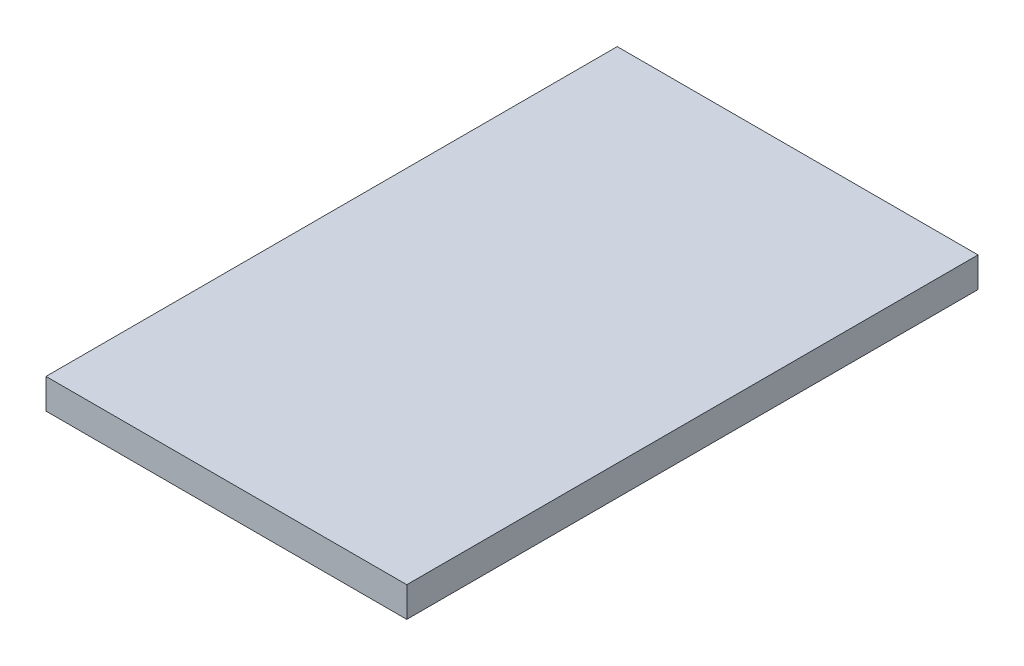
ISO-10303-21;
HEADER;
FILE_DESCRIPTION(('STEP AP214'),'2;1');
FILE_NAME('part.step','',(''),(''),'','','');
FILE_SCHEMA(('AUTOMOTIVE_DESIGN { 1 0 10303 214 1 1 1 1 }'));
ENDSEC;
DATA;
#1=APPLICATION_CONTEXT('core data for automotive mechanical design processes');
#2=APPLICATION_PROTOCOL_DEFINITION('international standard','automotive_design',2000,#1);
#3=PRODUCT_CONTEXT('',#1,'mechanical');
#4=PRODUCT('Part','Part','',(#3));
#5=PRODUCT_RELATED_PRODUCT_CATEGORY('part','',(#4));
#6=PRODUCT_DEFINITION_FORMATION('','',#4);
#7=PRODUCT_DEFINITION_CONTEXT('part definition',#1,'design');
#8=PRODUCT_DEFINITION('design','',#6,#7);
#9=PRODUCT_DEFINITION_SHAPE('','',#8);
#10=(LENGTH_UNIT() NAMED_UNIT(*) SI_UNIT(.MILLI.,.METRE.));
#11=(NAMED_UNIT(*) PLANE_ANGLE_UNIT() SI_UNIT($,.RADIAN.));
#12=(NAMED_UNIT(*) SI_UNIT($,.STERADIAN.) SOLID_ANGLE_UNIT());
#13=UNCERTAINTY_MEASURE_WITH_UNIT(LENGTH_MEASURE(1.E-05),#10,'distance_accuracy_value','');
#14=(GEOMETRIC_REPRESENTATION_CONTEXT(3) GLOBAL_UNCERTAINTY_ASSIGNED_CONTEXT((#13)) GLOBAL_UNIT_ASSIGNED_CONTEXT((#10,
#11,#12)) REPRESENTATION_CONTEXT('',''));
#15=CARTESIAN_POINT('',(0.,0.,0.));
#16=DIRECTION('',(0.,0.,1.));
#17=DIRECTION('',(1.,0.,0.));
#18=AXIS2_PLACEMENT_3D('',#15,#16,#17);
#19=CARTESIAN_POINT('',(0.,1.,0.));
#20=DIRECTION('',(1.,0.,0.));
#21=DIRECTION('',(0.,0.,-1.));
#22=AXIS2_PLACEMENT_3D('',#19,#20,#21);
#23=PLANE('',#22);
#24=DIRECTION('',(0.,0.,1.));
#25=VECTOR('',#24,1.);
#26=CARTESIAN_POINT('',(0.,0.,0.));
#27=LINE('',#26,#25);
#28=CARTESIAN_POINT('',(0.,0.,-19.));
#29=VERTEX_POINT('',#28);
#30=CARTESIAN_POINT('',(0.,0.,0.));
#31=VERTEX_POINT('',#30);
#32=EDGE_CURVE('E107',#29,#31,#27,.T.);
#33=ORIENTED_EDGE('',*,*,#32,.T.);
#34=DIRECTION('',(0.,-1.,0.));
#35=VECTOR('',#34,1.);
#36=CARTESIAN_POINT('',(0.,1.,0.));
#37=LINE('',#36,#35);
#38=CARTESIAN_POINT('',(0.,1.,0.));
#39=VERTEX_POINT('',#38);
#40=EDGE_CURVE('E11',#39,#31,#37,.T.);
#41=ORIENTED_EDGE('',*,*,#40,.F.);
#42=DIRECTION('',(0.,0.,1.));
#43=VECTOR('',#42,1.);
#44=CARTESIAN_POINT('',(0.,1.,0.));
#45=LINE('',#44,#43);
#46=CARTESIAN_POINT('',(0.,1.,-19.));
#47=VERTEX_POINT('',#46);
#48=EDGE_CURVE('E91',#47,#39,#45,.T.);
#49=ORIENTED_EDGE('',*,*,#48,.F.);
#50=DIRECTION('',(0.,-1.,0.));
#51=VECTOR('',#50,1.);
#52=CARTESIAN_POINT('',(0.,1.,-19.));
#53=LINE('',#52,#51);
#54=EDGE_CURVE('E103',#47,#29,#53,.T.);
#55=ORIENTED_EDGE('',*,*,#54,.T.);
#56=EDGE_LOOP('',(#33,#41,#49,#55));
#57=FACE_BOUND('',#56,.T.);
#58=ADVANCED_FACE('F39',(#57),#23,.F.);
#59=CARTESIAN_POINT('',(0.,1.,0.));
#60=DIRECTION('',(0.,0.,-1.));
#61=DIRECTION('',(-1.,0.,0.));
#62=AXIS2_PLACEMENT_3D('',#59,#60,#61);
#63=PLANE('',#62);
#64=DIRECTION('',(1.,0.,0.));
#65=VECTOR('',#64,1.);
#66=CARTESIAN_POINT('',(0.,0.,0.));
#67=LINE('',#66,#65);
#68=CARTESIAN_POINT('',(12.,0.,0.));
#69=VERTEX_POINT('',#68);
#70=EDGE_CURVE('E96',#31,#69,#67,.T.);
#71=ORIENTED_EDGE('',*,*,#70,.T.);
#72=DIRECTION('',(0.,-1.,0.));
#73=VECTOR('',#72,1.);
#74=CARTESIAN_POINT('',(12.,1.,0.));
#75=LINE('',#74,#73);
#76=CARTESIAN_POINT('',(12.,1.,0.));
#77=VERTEX_POINT('',#76);
#78=EDGE_CURVE('E48',#77,#69,#75,.T.);
#79=ORIENTED_EDGE('',*,*,#78,.F.);
#80=DIRECTION('',(1.,0.,0.));
#81=VECTOR('',#80,1.);
#82=CARTESIAN_POINT('',(0.,1.,0.));
#83=LINE('',#82,#81);
#84=EDGE_CURVE('E86',#39,#77,#83,.T.);
#85=ORIENTED_EDGE('',*,*,#84,.F.);
#86=ORIENTED_EDGE('',*,*,#40,.T.);
#87=EDGE_LOOP('',(#71,#79,#85,#86));
#88=FACE_BOUND('',#87,.T.);
#89=ADVANCED_FACE('F95',(#88),#63,.F.);
#90=CARTESIAN_POINT('',(12.,1.,0.));
#91=DIRECTION('',(-1.,0.,0.));
#92=DIRECTION('',(0.,0.,1.));
#93=AXIS2_PLACEMENT_3D('',#90,#91,#92);
#94=PLANE('',#93);
#95=DIRECTION('',(0.,0.,-1.));
#96=VECTOR('',#95,1.);
#97=CARTESIAN_POINT('',(12.,0.,0.));
#98=LINE('',#97,#96);
#99=CARTESIAN_POINT('',(12.,0.,-19.));
#100=VERTEX_POINT('',#99);
#101=EDGE_CURVE('E73',#69,#100,#98,.T.);
#102=ORIENTED_EDGE('',*,*,#101,.T.);
#103=DIRECTION('',(0.,-1.,0.));
#104=VECTOR('',#103,1.);
#105=CARTESIAN_POINT('',(12.,1.,-19.));
#106=LINE('',#105,#104);
#107=CARTESIAN_POINT('',(12.,1.,-19.));
#108=VERTEX_POINT('',#107);
#109=EDGE_CURVE('E98',#108,#100,#106,.T.);
#110=ORIENTED_EDGE('',*,*,#109,.F.);
#111=DIRECTION('',(0.,0.,-1.));
#112=VECTOR('',#111,1.);
#113=CARTESIAN_POINT('',(12.,1.,0.));
#114=LINE('',#113,#112);
#115=EDGE_CURVE('E89',#77,#108,#114,.T.);
#116=ORIENTED_EDGE('',*,*,#115,.F.);
#117=ORIENTED_EDGE('',*,*,#78,.T.);
#118=EDGE_LOOP('',(#102,#110,#116,#117));
#119=FACE_BOUND('',#118,.T.);
#120=ADVANCED_FACE('F99',(#119),#94,.F.);
#121=CARTESIAN_POINT('',(0.,1.,-19.));
#122=DIRECTION('',(0.,0.,1.));
#123=DIRECTION('',(1.,0.,0.));
#124=AXIS2_PLACEMENT_3D('',#121,#122,#123);
#125=PLANE('',#124);
#126=DIRECTION('',(-1.,0.,0.));
#127=VECTOR('',#126,1.);
#128=CARTESIAN_POINT('',(0.,0.,-19.));
#129=LINE('',#128,#127);
#130=EDGE_CURVE('E79',#100,#29,#129,.T.);
#131=ORIENTED_EDGE('',*,*,#130,.T.);
#132=ORIENTED_EDGE('',*,*,#54,.F.);
#133=DIRECTION('',(-1.,0.,0.));
#134=VECTOR('',#133,1.);
#135=CARTESIAN_POINT('',(0.,1.,-19.));
#136=LINE('',#135,#134);
#137=EDGE_CURVE('E56',#108,#47,#136,.T.);
#138=ORIENTED_EDGE('',*,*,#137,.F.);
#139=ORIENTED_EDGE('',*,*,#109,.T.);
#140=EDGE_LOOP('',(#131,#132,#138,#139));
#141=FACE_BOUND('',#140,.T.);
#142=ADVANCED_FACE('F120',(#141),#125,.F.);
#143=CARTESIAN_POINT('',(0.,1.,0.));
#144=DIRECTION('',(0.,-1.,0.));
#145=DIRECTION('',(0.,0.,-1.));
#146=AXIS2_PLACEMENT_3D('',#143,#144,#145);
#147=PLANE('',#146);
#148=ORIENTED_EDGE('',*,*,#48,.T.);
#149=ORIENTED_EDGE('',*,*,#84,.T.);
#150=ORIENTED_EDGE('',*,*,#115,.T.);
#151=ORIENTED_EDGE('',*,*,#137,.T.);
#152=EDGE_LOOP('',(#148,#149,#150,#151));
#153=FACE_BOUND('',#152,.T.);
#154=ADVANCED_FACE('F87',(#153),#147,.F.);
#155=CARTESIAN_POINT('',(0.,0.,0.));
#156=DIRECTION('',(0.,-1.,0.));
#157=DIRECTION('',(0.,0.,-1.));
#158=AXIS2_PLACEMENT_3D('',#155,#156,#157);
#159=PLANE('',#158);
#160=ORIENTED_EDGE('',*,*,#32,.F.);
#161=ORIENTED_EDGE('',*,*,#130,.F.);
#162=ORIENTED_EDGE('',*,*,#101,.F.);
#163=ORIENTED_EDGE('',*,*,#70,.F.);
#164=EDGE_LOOP('',(#160,#161,#162,#163));
#165=FACE_BOUND('',#164,.T.);
#166=ADVANCED_FACE('F123',(#165),#159,.T.);
#167=CLOSED_SHELL('',(#58,#89,#120,#142,#154,#166));
#168=MANIFOLD_SOLID_BREP('B2',#167);
#169=ADVANCED_BREP_SHAPE_REPRESENTATION('',(#18,#168),#14);
#170=SHAPE_DEFINITION_REPRESENTATION(#9,#169);
ENDSEC;
END-ISO-10303-21;
